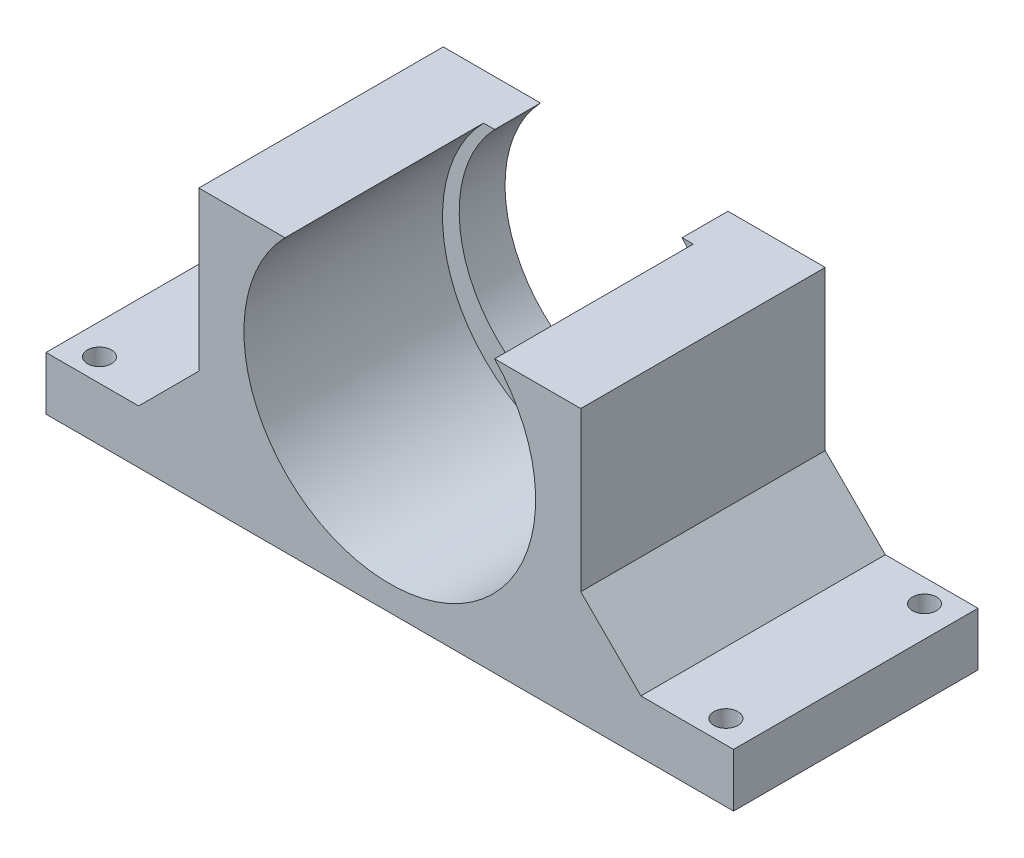
ISO-10303-21;
HEADER;
FILE_DESCRIPTION(('STEP AP214'),'2;1');
FILE_NAME('part.step','',(''),(''),'','','');
FILE_SCHEMA(('AUTOMOTIVE_DESIGN { 1 0 10303 214 1 1 1 1 }'));
ENDSEC;
DATA;
#1=APPLICATION_CONTEXT('core data for automotive mechanical design processes');
#2=APPLICATION_PROTOCOL_DEFINITION('international standard','automotive_design',2000,#1);
#3=PRODUCT_CONTEXT('',#1,'mechanical');
#4=PRODUCT('Part','Part','',(#3));
#5=PRODUCT_RELATED_PRODUCT_CATEGORY('part','',(#4));
#6=PRODUCT_DEFINITION_FORMATION('','',#4);
#7=PRODUCT_DEFINITION_CONTEXT('part definition',#1,'design');
#8=PRODUCT_DEFINITION('design','',#6,#7);
#9=PRODUCT_DEFINITION_SHAPE('','',#8);
#10=(LENGTH_UNIT() NAMED_UNIT(*) SI_UNIT(.MILLI.,.METRE.));
#11=(NAMED_UNIT(*) PLANE_ANGLE_UNIT() SI_UNIT($,.RADIAN.));
#12=(NAMED_UNIT(*) SI_UNIT($,.STERADIAN.) SOLID_ANGLE_UNIT());
#13=UNCERTAINTY_MEASURE_WITH_UNIT(LENGTH_MEASURE(1.E-05),#10,'distance_accuracy_value','');
#14=(GEOMETRIC_REPRESENTATION_CONTEXT(3) GLOBAL_UNCERTAINTY_ASSIGNED_CONTEXT((#13)) GLOBAL_UNIT_ASSIGNED_CONTEXT((#10,
#11,#12)) REPRESENTATION_CONTEXT('',''));
#15=CARTESIAN_POINT('',(0.,0.,0.));
#16=DIRECTION('',(0.,0.,1.));
#17=DIRECTION('',(1.,0.,0.));
#18=AXIS2_PLACEMENT_3D('',#15,#16,#17);
#19=CARTESIAN_POINT('',(0.,14.7828,0.));
#20=DIRECTION('',(0.,-1.,0.));
#21=DIRECTION('',(0.,0.,-1.));
#22=AXIS2_PLACEMENT_3D('',#19,#20,#21);
#23=PLANE('',#22);
#24=DIRECTION('',(1.,0.,0.));
#25=VECTOR('',#24,1.);
#26=CARTESIAN_POINT('',(0.,14.7828,7.62));
#27=LINE('',#26,#25);
#28=CARTESIAN_POINT('',(-17.4272337495083,14.7828,7.62));
#29=VERTEX_POINT('',#28);
#30=CARTESIAN_POINT('',(-15.5819525583188,14.7828,7.62));
#31=VERTEX_POINT('',#30);
#32=EDGE_CURVE('E154',#29,#31,#27,.T.);
#33=ORIENTED_EDGE('',*,*,#32,.T.);
#34=DIRECTION('',(0.,0.,-1.));
#35=VECTOR('',#34,1.);
#36=CARTESIAN_POINT('',(-15.5819525583188,14.7828,40.64));
#37=LINE('',#36,#35);
#38=CARTESIAN_POINT('',(-15.5819525583188,14.7828,0.));
#39=VERTEX_POINT('',#38);
#40=EDGE_CURVE('E140',#31,#39,#37,.T.);
#41=ORIENTED_EDGE('',*,*,#40,.T.);
#42=DIRECTION('',(-1.,0.,0.));
#43=VECTOR('',#42,1.);
#44=CARTESIAN_POINT('',(-31.75,14.7828,0.));
#45=LINE('',#44,#43);
#46=CARTESIAN_POINT('',(-31.75,14.7828,0.));
#47=VERTEX_POINT('',#46);
#48=EDGE_CURVE('E151',#39,#47,#45,.T.);
#49=ORIENTED_EDGE('',*,*,#48,.T.);
#50=DIRECTION('',(0.,0.,1.));
#51=VECTOR('',#50,1.);
#52=CARTESIAN_POINT('',(-31.75,14.7828,40.64));
#53=LINE('',#52,#51);
#54=CARTESIAN_POINT('',(-31.75,14.7828,40.64));
#55=VERTEX_POINT('',#54);
#56=EDGE_CURVE('E217',#47,#55,#53,.T.);
#57=ORIENTED_EDGE('',*,*,#56,.T.);
#58=DIRECTION('',(1.,0.,0.));
#59=VECTOR('',#58,1.);
#60=CARTESIAN_POINT('',(-31.75,14.7828,40.64));
#61=LINE('',#60,#59);
#62=CARTESIAN_POINT('',(-17.4272337495083,14.7828,40.64));
#63=VERTEX_POINT('',#62);
#64=EDGE_CURVE('E166',#55,#63,#61,.T.);
#65=ORIENTED_EDGE('',*,*,#64,.T.);
#66=DIRECTION('',(0.,0.,1.));
#67=VECTOR('',#66,1.);
#68=CARTESIAN_POINT('',(-17.4272337495083,14.7828,7.62));
#69=LINE('',#68,#67);
#70=EDGE_CURVE('E164',#29,#63,#69,.T.);
#71=ORIENTED_EDGE('',*,*,#70,.F.);
#72=EDGE_LOOP('',(#33,#41,#49,#57,#65,#71));
#73=FACE_BOUND('',#72,.T.);
#74=ADVANCED_FACE('F38',(#73),#23,.F.);
#75=CARTESIAN_POINT('',(31.75,-30.48,40.64));
#76=DIRECTION('',(-1.,0.,0.));
#77=DIRECTION('',(0.,0.,1.));
#78=AXIS2_PLACEMENT_3D('',#75,#76,#77);
#79=PLANE('',#78);
#80=DIRECTION('',(0.,1.,0.));
#81=VECTOR('',#80,1.);
#82=CARTESIAN_POINT('',(31.75,-30.48,40.64));
#83=LINE('',#82,#81);
#84=CARTESIAN_POINT('',(31.75,-11.5899999999999,40.64));
#85=VERTEX_POINT('',#84);
#86=CARTESIAN_POINT('',(31.75,14.7828,40.64));
#87=VERTEX_POINT('',#86);
#88=EDGE_CURVE('E182',#85,#87,#83,.T.);
#89=ORIENTED_EDGE('',*,*,#88,.F.);
#90=DIRECTION('',(0.,0.,-1.));
#91=VECTOR('',#90,1.);
#92=CARTESIAN_POINT('',(31.75,-11.5899999999999,0.));
#93=LINE('',#92,#91);
#94=CARTESIAN_POINT('',(31.75,-11.5899999999999,0.));
#95=VERTEX_POINT('',#94);
#96=EDGE_CURVE('E200',#85,#95,#93,.T.);
#97=ORIENTED_EDGE('',*,*,#96,.T.);
#98=DIRECTION('',(0.,1.,0.));
#99=VECTOR('',#98,1.);
#100=CARTESIAN_POINT('',(31.75,-30.48,0.));
#101=LINE('',#100,#99);
#102=CARTESIAN_POINT('',(31.75,14.7828,0.));
#103=VERTEX_POINT('',#102);
#104=EDGE_CURVE('E179',#95,#103,#101,.T.);
#105=ORIENTED_EDGE('',*,*,#104,.T.);
#106=DIRECTION('',(0.,0.,-1.));
#107=VECTOR('',#106,1.);
#108=CARTESIAN_POINT('',(31.75,14.7828,40.64));
#109=LINE('',#108,#107);
#110=EDGE_CURVE('E162',#87,#103,#109,.T.);
#111=ORIENTED_EDGE('',*,*,#110,.F.);
#112=EDGE_LOOP('',(#89,#97,#105,#111));
#113=FACE_BOUND('',#112,.T.);
#114=ADVANCED_FACE('F256',(#113),#79,.F.);
#115=CARTESIAN_POINT('',(-31.75,-30.48,40.64));
#116=DIRECTION('',(1.,0.,0.));
#117=DIRECTION('',(0.,0.,-1.));
#118=AXIS2_PLACEMENT_3D('',#115,#116,#117);
#119=PLANE('',#118);
#120=DIRECTION('',(0.,-1.,0.));
#121=VECTOR('',#120,1.);
#122=CARTESIAN_POINT('',(-31.75,-30.48,0.));
#123=LINE('',#122,#121);
#124=CARTESIAN_POINT('',(-31.75,-11.5899999999999,0.));
#125=VERTEX_POINT('',#124);
#126=EDGE_CURVE('E160',#47,#125,#123,.T.);
#127=ORIENTED_EDGE('',*,*,#126,.T.);
#128=DIRECTION('',(0.,0.,1.));
#129=VECTOR('',#128,1.);
#130=CARTESIAN_POINT('',(-31.75,-11.5899999999999,40.64));
#131=LINE('',#130,#129);
#132=CARTESIAN_POINT('',(-31.75,-11.5899999999999,40.64));
#133=VERTEX_POINT('',#132);
#134=EDGE_CURVE('E155',#125,#133,#131,.T.);
#135=ORIENTED_EDGE('',*,*,#134,.T.);
#136=DIRECTION('',(0.,-1.,0.));
#137=VECTOR('',#136,1.);
#138=CARTESIAN_POINT('',(-31.75,-30.48,40.64));
#139=LINE('',#138,#137);
#140=EDGE_CURVE('E184',#55,#133,#139,.T.);
#141=ORIENTED_EDGE('',*,*,#140,.F.);
#142=ORIENTED_EDGE('',*,*,#56,.F.);
#143=EDGE_LOOP('',(#127,#135,#141,#142));
#144=FACE_BOUND('',#143,.T.);
#145=ADVANCED_FACE('F215',(#144),#119,.F.);
#146=CARTESIAN_POINT('',(-31.75,-30.48,40.64));
#147=DIRECTION('',(0.,1.,0.));
#148=DIRECTION('',(0.,0.,1.));
#149=AXIS2_PLACEMENT_3D('',#146,#147,#148);
#150=PLANE('',#149);
#151=CARTESIAN_POINT('',(-52.07,-30.48,36.83));
#152=DIRECTION('',(0.,1.,0.));
#153=DIRECTION('',(0.,0.,1.));
#154=AXIS2_PLACEMENT_3D('',#151,#152,#153);
#155=CIRCLE('',#154,2.);
#156=CARTESIAN_POINT('',(-52.07,-30.48,38.83));
#157=VERTEX_POINT('',#156);
#158=EDGE_CURVE('E461',#157,#157,#155,.T.);
#159=ORIENTED_EDGE('',*,*,#158,.T.);
#160=EDGE_LOOP('',(#159));
#161=FACE_BOUND('',#160,.T.);
#162=CARTESIAN_POINT('',(52.07,-30.48,3.80999999999999));
#163=DIRECTION('',(0.,1.,0.));
#164=DIRECTION('',(0.,0.,1.));
#165=AXIS2_PLACEMENT_3D('',#162,#163,#164);
#166=CIRCLE('',#165,2.);
#167=CARTESIAN_POINT('',(52.07,-30.48,5.81));
#168=VERTEX_POINT('',#167);
#169=EDGE_CURVE('E465',#168,#168,#166,.T.);
#170=ORIENTED_EDGE('',*,*,#169,.T.);
#171=EDGE_LOOP('',(#170));
#172=FACE_BOUND('',#171,.T.);
#173=CARTESIAN_POINT('',(52.07,-30.48,36.83));
#174=DIRECTION('',(0.,1.,0.));
#175=DIRECTION('',(0.,0.,1.));
#176=AXIS2_PLACEMENT_3D('',#173,#174,#175);
#177=CIRCLE('',#176,2.);
#178=CARTESIAN_POINT('',(52.07,-30.48,38.83));
#179=VERTEX_POINT('',#178);
#180=EDGE_CURVE('E469',#179,#179,#177,.T.);
#181=ORIENTED_EDGE('',*,*,#180,.T.);
#182=EDGE_LOOP('',(#181));
#183=FACE_BOUND('',#182,.T.);
#184=CARTESIAN_POINT('',(-52.07,-30.48,3.80999999999999));
#185=DIRECTION('',(0.,1.,0.));
#186=DIRECTION('',(0.,0.,1.));
#187=AXIS2_PLACEMENT_3D('',#184,#185,#186);
#188=CIRCLE('',#187,2.);
#189=CARTESIAN_POINT('',(-52.07,-30.48,5.81));
#190=VERTEX_POINT('',#189);
#191=EDGE_CURVE('E473',#190,#190,#188,.T.);
#192=ORIENTED_EDGE('',*,*,#191,.T.);
#193=EDGE_LOOP('',(#192));
#194=FACE_BOUND('',#193,.T.);
#195=DIRECTION('',(1.,0.,0.));
#196=VECTOR('',#195,1.);
#197=CARTESIAN_POINT('',(-31.75,-30.48,0.));
#198=LINE('',#197,#196);
#199=CARTESIAN_POINT('',(-57.15,-30.48,0.));
#200=VERTEX_POINT('',#199);
#201=CARTESIAN_POINT('',(57.15,-30.48,0.));
#202=VERTEX_POINT('',#201);
#203=EDGE_CURVE('E185',#200,#202,#198,.T.);
#204=ORIENTED_EDGE('',*,*,#203,.T.);
#205=DIRECTION('',(0.,0.,1.));
#206=VECTOR('',#205,1.);
#207=CARTESIAN_POINT('',(57.15,-30.48,40.64));
#208=LINE('',#207,#206);
#209=CARTESIAN_POINT('',(57.15,-30.48,40.64));
#210=VERTEX_POINT('',#209);
#211=EDGE_CURVE('E477',#202,#210,#208,.T.);
#212=ORIENTED_EDGE('',*,*,#211,.T.);
#213=DIRECTION('',(1.,0.,0.));
#214=VECTOR('',#213,1.);
#215=CARTESIAN_POINT('',(-31.75,-30.48,40.64));
#216=LINE('',#215,#214);
#217=CARTESIAN_POINT('',(-57.15,-30.48,40.64));
#218=VERTEX_POINT('',#217);
#219=EDGE_CURVE('E188',#218,#210,#216,.T.);
#220=ORIENTED_EDGE('',*,*,#219,.F.);
#221=DIRECTION('',(0.,0.,-1.));
#222=VECTOR('',#221,1.);
#223=CARTESIAN_POINT('',(-57.15,-30.48,40.64));
#224=LINE('',#223,#222);
#225=EDGE_CURVE('E231',#218,#200,#224,.T.);
#226=ORIENTED_EDGE('',*,*,#225,.T.);
#227=EDGE_LOOP('',(#204,#212,#220,#226));
#228=FACE_BOUND('',#227,.T.);
#229=ADVANCED_FACE('F328',(#161,#172,#183,#194,#228),#150,.F.);
#230=CARTESIAN_POINT('',(0.,0.,40.64));
#231=DIRECTION('',(0.,0.,-1.));
#232=DIRECTION('',(-1.,0.,0.));
#233=AXIS2_PLACEMENT_3D('',#230,#231,#232);
#234=PLANE('',#233);
#235=ORIENTED_EDGE('',*,*,#219,.T.);
#236=DIRECTION('',(0.,-1.,0.));
#237=VECTOR('',#236,1.);
#238=CARTESIAN_POINT('',(57.15,-21.59,40.64));
#239=LINE('',#238,#237);
#240=CARTESIAN_POINT('',(57.15,-21.59,40.64));
#241=VERTEX_POINT('',#240);
#242=EDGE_CURVE('E235',#241,#210,#239,.T.);
#243=ORIENTED_EDGE('',*,*,#242,.F.);
#244=DIRECTION('',(-1.,0.,0.));
#245=VECTOR('',#244,1.);
#246=CARTESIAN_POINT('',(31.75,-21.59,40.64));
#247=LINE('',#246,#245);
#248=CARTESIAN_POINT('',(41.75,-21.59,40.64));
#249=VERTEX_POINT('',#248);
#250=EDGE_CURVE('E482',#241,#249,#247,.T.);
#251=ORIENTED_EDGE('',*,*,#250,.T.);
#252=DIRECTION('',(0.707106781186544,-0.707106781186551,0.));
#253=VECTOR('',#252,1.);
#254=CARTESIAN_POINT('',(10.0800000000002,10.0800000000001,40.64));
#255=LINE('',#254,#253);
#256=EDGE_CURVE('E11',#249,#85,#255,.F.);
#257=ORIENTED_EDGE('',*,*,#256,.T.);
#258=ORIENTED_EDGE('',*,*,#88,.T.);
#259=CARTESIAN_POINT('',(17.4272337495083,14.7828,40.64));
#260=VERTEX_POINT('',#259);
#261=EDGE_CURVE('E247',#260,#87,#61,.T.);
#262=ORIENTED_EDGE('',*,*,#261,.F.);
#263=CARTESIAN_POINT('',(0.,-2.07999999999999,40.64));
#264=DIRECTION('',(0.,0.,1.));
#265=DIRECTION('',(1.,0.,0.));
#266=AXIS2_PLACEMENT_3D('',#263,#264,#265);
#267=CIRCLE('',#266,24.25);
#268=EDGE_CURVE('E175',#63,#260,#267,.T.);
#269=ORIENTED_EDGE('',*,*,#268,.F.);
#270=ORIENTED_EDGE('',*,*,#64,.F.);
#271=ORIENTED_EDGE('',*,*,#140,.T.);
#272=DIRECTION('',(-0.707106781186544,-0.707106781186551,0.));
#273=VECTOR('',#272,1.);
#274=CARTESIAN_POINT('',(-10.0800000000002,10.0800000000001,40.64));
#275=LINE('',#274,#273);
#276=CARTESIAN_POINT('',(-41.75,-21.59,40.64));
#277=VERTEX_POINT('',#276);
#278=EDGE_CURVE('E204',#133,#277,#275,.T.);
#279=ORIENTED_EDGE('',*,*,#278,.T.);
#280=DIRECTION('',(-1.,0.,0.));
#281=VECTOR('',#280,1.);
#282=CARTESIAN_POINT('',(-31.75,-21.59,40.64));
#283=LINE('',#282,#281);
#284=CARTESIAN_POINT('',(-57.15,-21.59,40.64));
#285=VERTEX_POINT('',#284);
#286=EDGE_CURVE('E223',#277,#285,#283,.T.);
#287=ORIENTED_EDGE('',*,*,#286,.T.);
#288=DIRECTION('',(0.,-1.,0.));
#289=VECTOR('',#288,1.);
#290=CARTESIAN_POINT('',(-57.15,-21.59,40.64));
#291=LINE('',#290,#289);
#292=EDGE_CURVE('E241',#285,#218,#291,.T.);
#293=ORIENTED_EDGE('',*,*,#292,.T.);
#294=EDGE_LOOP('',(#235,#243,#251,#257,#258,#262,#269,#270,#271,#279,#287,#293));
#295=FACE_BOUND('',#294,.T.);
#296=ADVANCED_FACE('F221',(#295),#234,.F.);
#297=CARTESIAN_POINT('',(0.,0.,0.));
#298=DIRECTION('',(0.,0.,-1.));
#299=DIRECTION('',(-1.,0.,0.));
#300=AXIS2_PLACEMENT_3D('',#297,#298,#299);
#301=PLANE('',#300);
#302=CARTESIAN_POINT('',(0.,0.,0.));
#303=DIRECTION('',(0.,0.,-1.));
#304=DIRECTION('',(-1.,0.,0.));
#305=AXIS2_PLACEMENT_3D('',#302,#303,#304);
#306=CIRCLE('',#305,21.478557246);
#307=CARTESIAN_POINT('',(15.5819525583188,14.7828,0.));
#308=VERTEX_POINT('',#307);
#309=EDGE_CURVE('E137',#308,#39,#306,.T.);
#310=ORIENTED_EDGE('',*,*,#309,.F.);
#311=EDGE_CURVE('E161',#103,#308,#45,.T.);
#312=ORIENTED_EDGE('',*,*,#311,.F.);
#313=ORIENTED_EDGE('',*,*,#104,.F.);
#314=DIRECTION('',(-0.707106781186544,0.707106781186551,0.));
#315=VECTOR('',#314,1.);
#316=CARTESIAN_POINT('',(31.75,-11.5899999999999,0.));
#317=LINE('',#316,#315);
#318=CARTESIAN_POINT('',(41.75,-21.59,0.));
#319=VERTEX_POINT('',#318);
#320=EDGE_CURVE('E46',#95,#319,#317,.F.);
#321=ORIENTED_EDGE('',*,*,#320,.T.);
#322=DIRECTION('',(1.,0.,0.));
#323=VECTOR('',#322,1.);
#324=CARTESIAN_POINT('',(31.75,-21.59,0.));
#325=LINE('',#324,#323);
#326=CARTESIAN_POINT('',(57.15,-21.59,0.));
#327=VERTEX_POINT('',#326);
#328=EDGE_CURVE('E479',#319,#327,#325,.T.);
#329=ORIENTED_EDGE('',*,*,#328,.T.);
#330=DIRECTION('',(0.,-1.,0.));
#331=VECTOR('',#330,1.);
#332=CARTESIAN_POINT('',(57.15,-21.59,0.));
#333=LINE('',#332,#331);
#334=EDGE_CURVE('E238',#327,#202,#333,.T.);
#335=ORIENTED_EDGE('',*,*,#334,.T.);
#336=ORIENTED_EDGE('',*,*,#203,.F.);
#337=DIRECTION('',(0.,-1.,0.));
#338=VECTOR('',#337,1.);
#339=CARTESIAN_POINT('',(-57.15,-21.59,0.));
#340=LINE('',#339,#338);
#341=CARTESIAN_POINT('',(-57.15,-21.59,0.));
#342=VERTEX_POINT('',#341);
#343=EDGE_CURVE('E243',#342,#200,#340,.T.);
#344=ORIENTED_EDGE('',*,*,#343,.F.);
#345=DIRECTION('',(1.,0.,0.));
#346=VECTOR('',#345,1.);
#347=CARTESIAN_POINT('',(-31.75,-21.59,0.));
#348=LINE('',#347,#346);
#349=CARTESIAN_POINT('',(-41.75,-21.59,0.));
#350=VERTEX_POINT('',#349);
#351=EDGE_CURVE('E210',#342,#350,#348,.T.);
#352=ORIENTED_EDGE('',*,*,#351,.T.);
#353=DIRECTION('',(0.707106781186544,0.707106781186551,0.));
#354=VECTOR('',#353,1.);
#355=CARTESIAN_POINT('',(-31.75,-11.5899999999999,0.));
#356=LINE('',#355,#354);
#357=EDGE_CURVE('E206',#350,#125,#356,.T.);
#358=ORIENTED_EDGE('',*,*,#357,.T.);
#359=ORIENTED_EDGE('',*,*,#126,.F.);
#360=ORIENTED_EDGE('',*,*,#48,.F.);
#361=EDGE_LOOP('',(#310,#312,#313,#321,#329,#335,#336,#344,#352,#358,#359,#360));
#362=FACE_BOUND('',#361,.T.);
#363=ADVANCED_FACE('F158',(#362),#301,.T.);
#364=CARTESIAN_POINT('',(0.,-2.07999999999999,7.62));
#365=DIRECTION('',(0.,0.,1.));
#366=DIRECTION('',(1.,0.,0.));
#367=AXIS2_PLACEMENT_3D('',#364,#365,#366);
#368=CYLINDRICAL_SURFACE('',#367,24.25);
#369=ORIENTED_EDGE('',*,*,#268,.T.);
#370=DIRECTION('',(0.,0.,1.));
#371=VECTOR('',#370,1.);
#372=CARTESIAN_POINT('',(17.4272337495083,14.7828,7.62));
#373=LINE('',#372,#371);
#374=CARTESIAN_POINT('',(17.4272337495083,14.7828,7.62));
#375=VERTEX_POINT('',#374);
#376=EDGE_CURVE('E172',#260,#375,#373,.F.);
#377=ORIENTED_EDGE('',*,*,#376,.T.);
#378=CARTESIAN_POINT('',(0.,-2.07999999999999,7.62));
#379=DIRECTION('',(0.,0.,1.));
#380=DIRECTION('',(1.,0.,0.));
#381=AXIS2_PLACEMENT_3D('',#378,#379,#380);
#382=CIRCLE('',#381,24.25);
#383=EDGE_CURVE('E176',#29,#375,#382,.T.);
#384=ORIENTED_EDGE('',*,*,#383,.F.);
#385=ORIENTED_EDGE('',*,*,#70,.T.);
#386=EDGE_LOOP('',(#369,#377,#384,#385));
#387=FACE_BOUND('',#386,.T.);
#388=ADVANCED_FACE('F263',(#387),#368,.F.);
#389=CARTESIAN_POINT('',(0.,-2.07999999999999,7.62));
#390=DIRECTION('',(0.,0.,1.));
#391=DIRECTION('',(1.,0.,0.));
#392=AXIS2_PLACEMENT_3D('',#389,#390,#391);
#393=PLANE('',#392);
#394=CARTESIAN_POINT('',(0.,0.,7.62));
#395=DIRECTION('',(0.,0.,1.));
#396=DIRECTION('',(1.,0.,0.));
#397=AXIS2_PLACEMENT_3D('',#394,#395,#396);
#398=CIRCLE('',#397,21.478557246);
#399=CARTESIAN_POINT('',(15.5819525583188,14.7828,7.62));
#400=VERTEX_POINT('',#399);
#401=EDGE_CURVE('E147',#31,#400,#398,.T.);
#402=ORIENTED_EDGE('',*,*,#401,.F.);
#403=ORIENTED_EDGE('',*,*,#32,.F.);
#404=ORIENTED_EDGE('',*,*,#383,.T.);
#405=EDGE_CURVE('E190',#400,#375,#27,.T.);
#406=ORIENTED_EDGE('',*,*,#405,.F.);
#407=EDGE_LOOP('',(#402,#403,#404,#406));
#408=FACE_BOUND('',#407,.T.);
#409=ADVANCED_FACE('F260',(#408),#393,.T.);
#410=ORIENTED_EDGE('',*,*,#311,.T.);
#411=DIRECTION('',(0.,0.,-1.));
#412=VECTOR('',#411,1.);
#413=CARTESIAN_POINT('',(15.5819525583188,14.7828,40.64));
#414=LINE('',#413,#412);
#415=EDGE_CURVE('E143',#308,#400,#414,.F.);
#416=ORIENTED_EDGE('',*,*,#415,.T.);
#417=ORIENTED_EDGE('',*,*,#405,.T.);
#418=ORIENTED_EDGE('',*,*,#376,.F.);
#419=ORIENTED_EDGE('',*,*,#261,.T.);
#420=ORIENTED_EDGE('',*,*,#110,.T.);
#421=EDGE_LOOP('',(#410,#416,#417,#418,#419,#420));
#422=FACE_BOUND('',#421,.T.);
#423=ADVANCED_FACE('F252',(#422),#23,.F.);
#424=CARTESIAN_POINT('',(-57.15,-21.59,40.64));
#425=DIRECTION('',(-1.,0.,0.));
#426=DIRECTION('',(0.,0.,1.));
#427=AXIS2_PLACEMENT_3D('',#424,#425,#426);
#428=PLANE('',#427);
#429=ORIENTED_EDGE('',*,*,#225,.F.);
#430=ORIENTED_EDGE('',*,*,#292,.F.);
#431=DIRECTION('',(0.,0.,-1.));
#432=VECTOR('',#431,1.);
#433=CARTESIAN_POINT('',(-57.15,-21.59,40.64));
#434=LINE('',#433,#432);
#435=EDGE_CURVE('E230',#285,#342,#434,.T.);
#436=ORIENTED_EDGE('',*,*,#435,.T.);
#437=ORIENTED_EDGE('',*,*,#343,.T.);
#438=EDGE_LOOP('',(#429,#430,#436,#437));
#439=FACE_BOUND('',#438,.T.);
#440=ADVANCED_FACE('F281',(#439),#428,.T.);
#441=CARTESIAN_POINT('',(0.,-21.59,0.));
#442=DIRECTION('',(0.,1.,0.));
#443=DIRECTION('',(0.,0.,1.));
#444=AXIS2_PLACEMENT_3D('',#441,#442,#443);
#445=PLANE('',#444);
#446=CARTESIAN_POINT('',(-52.07,-21.59,36.83));
#447=DIRECTION('',(0.,1.,0.));
#448=DIRECTION('',(0.,0.,1.));
#449=AXIS2_PLACEMENT_3D('',#446,#447,#448);
#450=CIRCLE('',#449,2.);
#451=CARTESIAN_POINT('',(-52.07,-21.59,38.83));
#452=VERTEX_POINT('',#451);
#453=EDGE_CURVE('E498',#452,#452,#450,.T.);
#454=ORIENTED_EDGE('',*,*,#453,.F.);
#455=EDGE_LOOP('',(#454));
#456=FACE_BOUND('',#455,.T.);
#457=CARTESIAN_POINT('',(-52.07,-21.59,3.80999999999999));
#458=DIRECTION('',(0.,1.,0.));
#459=DIRECTION('',(0.,0.,1.));
#460=AXIS2_PLACEMENT_3D('',#457,#458,#459);
#461=CIRCLE('',#460,2.);
#462=CARTESIAN_POINT('',(-52.07,-21.59,5.81));
#463=VERTEX_POINT('',#462);
#464=EDGE_CURVE('E487',#463,#463,#461,.T.);
#465=ORIENTED_EDGE('',*,*,#464,.F.);
#466=EDGE_LOOP('',(#465));
#467=FACE_BOUND('',#466,.T.);
#468=ORIENTED_EDGE('',*,*,#286,.F.);
#469=DIRECTION('',(0.,0.,-1.));
#470=VECTOR('',#469,1.);
#471=CARTESIAN_POINT('',(-41.75,-21.59,0.));
#472=LINE('',#471,#470);
#473=EDGE_CURVE('E198',#277,#350,#472,.T.);
#474=ORIENTED_EDGE('',*,*,#473,.T.);
#475=ORIENTED_EDGE('',*,*,#351,.F.);
#476=ORIENTED_EDGE('',*,*,#435,.F.);
#477=EDGE_LOOP('',(#468,#474,#475,#476));
#478=FACE_BOUND('',#477,.T.);
#479=ADVANCED_FACE('F228',(#456,#467,#478),#445,.T.);
#480=CARTESIAN_POINT('',(57.15,-21.59,40.64));
#481=DIRECTION('',(1.,0.,0.));
#482=DIRECTION('',(0.,0.,-1.));
#483=AXIS2_PLACEMENT_3D('',#480,#481,#482);
#484=PLANE('',#483);
#485=ORIENTED_EDGE('',*,*,#211,.F.);
#486=ORIENTED_EDGE('',*,*,#334,.F.);
#487=DIRECTION('',(0.,0.,1.));
#488=VECTOR('',#487,1.);
#489=CARTESIAN_POINT('',(57.15,-21.59,40.64));
#490=LINE('',#489,#488);
#491=EDGE_CURVE('E485',#327,#241,#490,.T.);
#492=ORIENTED_EDGE('',*,*,#491,.T.);
#493=ORIENTED_EDGE('',*,*,#242,.T.);
#494=EDGE_LOOP('',(#485,#486,#492,#493));
#495=FACE_BOUND('',#494,.T.);
#496=ADVANCED_FACE('F289',(#495),#484,.T.);
#497=CARTESIAN_POINT('',(0.,-21.59,0.));
#498=DIRECTION('',(0.,-1.,0.));
#499=DIRECTION('',(0.,0.,-1.));
#500=AXIS2_PLACEMENT_3D('',#497,#498,#499);
#501=PLANE('',#500);
#502=CARTESIAN_POINT('',(52.07,-21.59,3.80999999999999));
#503=DIRECTION('',(0.,1.,0.));
#504=DIRECTION('',(0.,0.,1.));
#505=AXIS2_PLACEMENT_3D('',#502,#503,#504);
#506=CIRCLE('',#505,2.);
#507=CARTESIAN_POINT('',(52.07,-21.59,5.81));
#508=VERTEX_POINT('',#507);
#509=EDGE_CURVE('E494',#508,#508,#506,.T.);
#510=ORIENTED_EDGE('',*,*,#509,.F.);
#511=EDGE_LOOP('',(#510));
#512=FACE_BOUND('',#511,.T.);
#513=CARTESIAN_POINT('',(52.07,-21.59,36.83));
#514=DIRECTION('',(0.,1.,0.));
#515=DIRECTION('',(0.,0.,1.));
#516=AXIS2_PLACEMENT_3D('',#513,#514,#515);
#517=CIRCLE('',#516,2.);
#518=CARTESIAN_POINT('',(52.07,-21.59,38.83));
#519=VERTEX_POINT('',#518);
#520=EDGE_CURVE('E502',#519,#519,#517,.T.);
#521=ORIENTED_EDGE('',*,*,#520,.F.);
#522=EDGE_LOOP('',(#521));
#523=FACE_BOUND('',#522,.T.);
#524=ORIENTED_EDGE('',*,*,#328,.F.);
#525=DIRECTION('',(0.,0.,1.));
#526=VECTOR('',#525,1.);
#527=CARTESIAN_POINT('',(41.75,-21.59,40.64));
#528=LINE('',#527,#526);
#529=EDGE_CURVE('E59',#319,#249,#528,.T.);
#530=ORIENTED_EDGE('',*,*,#529,.T.);
#531=ORIENTED_EDGE('',*,*,#250,.F.);
#532=ORIENTED_EDGE('',*,*,#491,.F.);
#533=EDGE_LOOP('',(#524,#530,#531,#532));
#534=FACE_BOUND('',#533,.T.);
#535=ADVANCED_FACE('F296',(#512,#523,#534),#501,.F.);
#536=CARTESIAN_POINT('',(52.07,-30.48,36.83));
#537=DIRECTION('',(0.,1.,0.));
#538=DIRECTION('',(0.,0.,1.));
#539=AXIS2_PLACEMENT_3D('',#536,#537,#538);
#540=CYLINDRICAL_SURFACE('',#539,2.);
#541=ORIENTED_EDGE('',*,*,#180,.F.);
#542=EDGE_LOOP('',(#541));
#543=FACE_BOUND('',#542,.T.);
#544=ORIENTED_EDGE('',*,*,#520,.T.);
#545=EDGE_LOOP('',(#544));
#546=FACE_BOUND('',#545,.T.);
#547=ADVANCED_FACE('F300',(#543,#546),#540,.F.);
#548=CARTESIAN_POINT('',(52.07,-30.48,3.80999999999999));
#549=DIRECTION('',(0.,1.,0.));
#550=DIRECTION('',(0.,0.,1.));
#551=AXIS2_PLACEMENT_3D('',#548,#549,#550);
#552=CYLINDRICAL_SURFACE('',#551,2.);
#553=ORIENTED_EDGE('',*,*,#169,.F.);
#554=EDGE_LOOP('',(#553));
#555=FACE_BOUND('',#554,.T.);
#556=ORIENTED_EDGE('',*,*,#509,.T.);
#557=EDGE_LOOP('',(#556));
#558=FACE_BOUND('',#557,.T.);
#559=ADVANCED_FACE('F306',(#555,#558),#552,.F.);
#560=CARTESIAN_POINT('',(-52.07,-30.48,3.80999999999999));
#561=DIRECTION('',(0.,1.,0.));
#562=DIRECTION('',(0.,0.,1.));
#563=AXIS2_PLACEMENT_3D('',#560,#561,#562);
#564=CYLINDRICAL_SURFACE('',#563,2.);
#565=ORIENTED_EDGE('',*,*,#191,.F.);
#566=EDGE_LOOP('',(#565));
#567=FACE_BOUND('',#566,.T.);
#568=ORIENTED_EDGE('',*,*,#464,.T.);
#569=EDGE_LOOP('',(#568));
#570=FACE_BOUND('',#569,.T.);
#571=ADVANCED_FACE('F302',(#567,#570),#564,.F.);
#572=CARTESIAN_POINT('',(-52.07,-30.48,36.83));
#573=DIRECTION('',(0.,1.,0.));
#574=DIRECTION('',(0.,0.,1.));
#575=AXIS2_PLACEMENT_3D('',#572,#573,#574);
#576=CYLINDRICAL_SURFACE('',#575,2.);
#577=ORIENTED_EDGE('',*,*,#158,.F.);
#578=EDGE_LOOP('',(#577));
#579=FACE_BOUND('',#578,.T.);
#580=ORIENTED_EDGE('',*,*,#453,.T.);
#581=EDGE_LOOP('',(#580));
#582=FACE_BOUND('',#581,.T.);
#583=ADVANCED_FACE('F305',(#579,#582),#576,.F.);
#584=CARTESIAN_POINT('',(0.,0.,40.64));
#585=DIRECTION('',(0.,0.,-1.));
#586=DIRECTION('',(-1.,0.,0.));
#587=AXIS2_PLACEMENT_3D('',#584,#585,#586);
#588=CYLINDRICAL_SURFACE('',#587,21.478557246);
#589=ORIENTED_EDGE('',*,*,#401,.T.);
#590=ORIENTED_EDGE('',*,*,#415,.F.);
#591=ORIENTED_EDGE('',*,*,#309,.T.);
#592=ORIENTED_EDGE('',*,*,#40,.F.);
#593=EDGE_LOOP('',(#589,#590,#591,#592));
#594=FACE_BOUND('',#593,.T.);
#595=ADVANCED_FACE('F139',(#594),#588,.F.);
#596=CARTESIAN_POINT('',(-31.75,-11.5899999999999,40.64));
#597=DIRECTION('',(0.707106781186551,-0.707106781186544,0.));
#598=DIRECTION('',(0.,0.,1.));
#599=AXIS2_PLACEMENT_3D('',#596,#597,#598);
#600=PLANE('',#599);
#601=ORIENTED_EDGE('',*,*,#357,.F.);
#602=ORIENTED_EDGE('',*,*,#473,.F.);
#603=ORIENTED_EDGE('',*,*,#278,.F.);
#604=ORIENTED_EDGE('',*,*,#134,.F.);
#605=EDGE_LOOP('',(#601,#602,#603,#604));
#606=FACE_BOUND('',#605,.T.);
#607=ADVANCED_FACE('F218',(#606),#600,.F.);
#608=CARTESIAN_POINT('',(31.75,-11.5899999999999,40.64));
#609=DIRECTION('',(0.707106781186551,0.707106781186544,0.));
#610=DIRECTION('',(0.,0.,1.));
#611=AXIS2_PLACEMENT_3D('',#608,#609,#610);
#612=PLANE('',#611);
#613=ORIENTED_EDGE('',*,*,#256,.F.);
#614=ORIENTED_EDGE('',*,*,#529,.F.);
#615=ORIENTED_EDGE('',*,*,#320,.F.);
#616=ORIENTED_EDGE('',*,*,#96,.F.);
#617=EDGE_LOOP('',(#613,#614,#615,#616));
#618=FACE_BOUND('',#617,.T.);
#619=ADVANCED_FACE('F40',(#618),#612,.T.);
#620=CLOSED_SHELL('',(#74,#114,#145,#229,#296,#363,#388,#409,#423,#440,#479,#496,#535,#547,#559,
#571,#583,#595,#607,#619));
#621=MANIFOLD_SOLID_BREP('B2',#620);
#622=ADVANCED_BREP_SHAPE_REPRESENTATION('',(#18,#621),#14);
#623=SHAPE_DEFINITION_REPRESENTATION(#9,#622);
ENDSEC;
END-ISO-10303-21;
